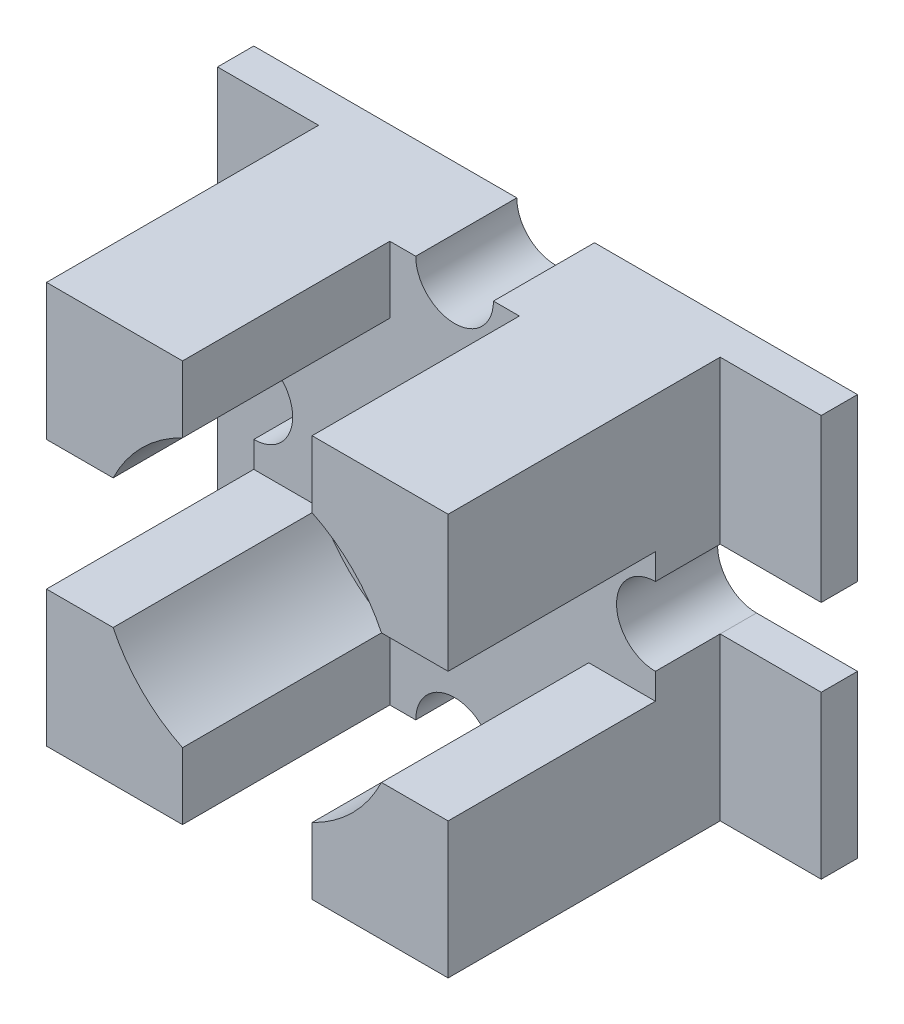
ISO-10303-21;
HEADER;
FILE_DESCRIPTION(('STEP AP214'),'2;1');
FILE_NAME('part.step','',(''),(''),'','','');
FILE_SCHEMA(('AUTOMOTIVE_DESIGN { 1 0 10303 214 1 1 1 1 }'));
ENDSEC;
DATA;
#1=APPLICATION_CONTEXT('core data for automotive mechanical design processes');
#2=APPLICATION_PROTOCOL_DEFINITION('international standard','automotive_design',2000,#1);
#3=PRODUCT_CONTEXT('',#1,'mechanical');
#4=PRODUCT('Part','Part','',(#3));
#5=PRODUCT_RELATED_PRODUCT_CATEGORY('part','',(#4));
#6=PRODUCT_DEFINITION_FORMATION('','',#4);
#7=PRODUCT_DEFINITION_CONTEXT('part definition',#1,'design');
#8=PRODUCT_DEFINITION('design','',#6,#7);
#9=PRODUCT_DEFINITION_SHAPE('','',#8);
#10=(LENGTH_UNIT() NAMED_UNIT(*) SI_UNIT(.MILLI.,.METRE.));
#11=(NAMED_UNIT(*) PLANE_ANGLE_UNIT() SI_UNIT($,.RADIAN.));
#12=(NAMED_UNIT(*) SI_UNIT($,.STERADIAN.) SOLID_ANGLE_UNIT());
#13=UNCERTAINTY_MEASURE_WITH_UNIT(LENGTH_MEASURE(1.E-05),#10,'distance_accuracy_value','');
#14=(GEOMETRIC_REPRESENTATION_CONTEXT(3) GLOBAL_UNCERTAINTY_ASSIGNED_CONTEXT((#13)) GLOBAL_UNIT_ASSIGNED_CONTEXT((#10,
#11,#12)) REPRESENTATION_CONTEXT('',''));
#15=CARTESIAN_POINT('',(0.,0.,0.));
#16=DIRECTION('',(0.,0.,1.));
#17=DIRECTION('',(1.,0.,0.));
#18=AXIS2_PLACEMENT_3D('',#15,#16,#17);
#19=CARTESIAN_POINT('',(-11.65,7.75,3.));
#20=DIRECTION('',(1.,0.,0.));
#21=DIRECTION('',(0.,1.,0.));
#22=AXIS2_PLACEMENT_3D('',#19,#20,#21);
#23=PLANE('',#22);
#24=DIRECTION('',(0.,1.,0.));
#25=VECTOR('',#24,1.);
#26=CARTESIAN_POINT('',(-11.65,7.75,1.6));
#27=LINE('',#26,#25);
#28=CARTESIAN_POINT('',(-11.65,1.5,1.6));
#29=VERTEX_POINT('',#28);
#30=CARTESIAN_POINT('',(-11.65,7.75,1.6));
#31=VERTEX_POINT('',#30);
#32=EDGE_CURVE('E745',#29,#31,#27,.T.);
#33=ORIENTED_EDGE('',*,*,#32,.F.);
#34=DIRECTION('',(0.,0.,-1.));
#35=VECTOR('',#34,1.);
#36=CARTESIAN_POINT('',(-11.65,1.5,13.));
#37=LINE('',#36,#35);
#38=CARTESIAN_POINT('',(-11.65,1.5,3.));
#39=VERTEX_POINT('',#38);
#40=EDGE_CURVE('E719',#39,#29,#37,.T.);
#41=ORIENTED_EDGE('',*,*,#40,.F.);
#42=DIRECTION('',(0.,-1.,0.));
#43=VECTOR('',#42,1.);
#44=CARTESIAN_POINT('',(-11.65,7.75,3.));
#45=LINE('',#44,#43);
#46=CARTESIAN_POINT('',(-11.65,7.75,3.));
#47=VERTEX_POINT('',#46);
#48=EDGE_CURVE('E539',#47,#39,#45,.T.);
#49=ORIENTED_EDGE('',*,*,#48,.F.);
#50=DIRECTION('',(0.,0.,-1.));
#51=VECTOR('',#50,1.);
#52=CARTESIAN_POINT('',(-11.65,7.75,3.));
#53=LINE('',#52,#51);
#54=EDGE_CURVE('E554',#47,#31,#53,.T.);
#55=ORIENTED_EDGE('',*,*,#54,.T.);
#56=EDGE_LOOP('',(#33,#41,#49,#55));
#57=FACE_BOUND('',#56,.T.);
#58=ADVANCED_FACE('F116',(#57),#23,.F.);
#59=CARTESIAN_POINT('',(11.65,-7.75,3.));
#60=DIRECTION('',(0.,1.,0.));
#61=DIRECTION('',(-1.,0.,0.));
#62=AXIS2_PLACEMENT_3D('',#59,#60,#61);
#63=PLANE('',#62);
#64=DIRECTION('',(-1.,0.,0.));
#65=VECTOR('',#64,1.);
#66=CARTESIAN_POINT('',(11.65,-7.75,1.6));
#67=LINE('',#66,#65);
#68=CARTESIAN_POINT('',(11.65,-7.75,1.6));
#69=VERTEX_POINT('',#68);
#70=CARTESIAN_POINT('',(1.5,-7.75,1.6));
#71=VERTEX_POINT('',#70);
#72=EDGE_CURVE('E734',#69,#71,#67,.T.);
#73=ORIENTED_EDGE('',*,*,#72,.F.);
#74=DIRECTION('',(0.,0.,-1.));
#75=VECTOR('',#74,1.);
#76=CARTESIAN_POINT('',(11.65,-7.75,3.));
#77=LINE('',#76,#75);
#78=CARTESIAN_POINT('',(11.65,-7.75,3.));
#79=VERTEX_POINT('',#78);
#80=EDGE_CURVE('E558',#79,#69,#77,.T.);
#81=ORIENTED_EDGE('',*,*,#80,.F.);
#82=DIRECTION('',(1.,0.,0.));
#83=VECTOR('',#82,1.);
#84=CARTESIAN_POINT('',(11.65,-7.75,3.));
#85=LINE('',#84,#83);
#86=CARTESIAN_POINT('',(7.75,-7.75,3.));
#87=VERTEX_POINT('',#86);
#88=EDGE_CURVE('E542',#87,#79,#85,.T.);
#89=ORIENTED_EDGE('',*,*,#88,.F.);
#90=DIRECTION('',(0.,0.,-1.));
#91=VECTOR('',#90,1.);
#92=CARTESIAN_POINT('',(7.75,-7.75,13.5));
#93=LINE('',#92,#91);
#94=CARTESIAN_POINT('',(7.75,-7.75,13.5));
#95=VERTEX_POINT('',#94);
#96=EDGE_CURVE('E532',#95,#87,#93,.T.);
#97=ORIENTED_EDGE('',*,*,#96,.F.);
#98=DIRECTION('',(1.,0.,0.));
#99=VECTOR('',#98,1.);
#100=CARTESIAN_POINT('',(7.75,-7.75,13.5));
#101=LINE('',#100,#99);
#102=CARTESIAN_POINT('',(2.5,-7.75,13.5));
#103=VERTEX_POINT('',#102);
#104=EDGE_CURVE('E506',#103,#95,#101,.T.);
#105=ORIENTED_EDGE('',*,*,#104,.F.);
#106=DIRECTION('',(0.,0.,1.));
#107=VECTOR('',#106,1.);
#108=CARTESIAN_POINT('',(2.5,-7.75,5.5));
#109=LINE('',#108,#107);
#110=CARTESIAN_POINT('',(2.5,-7.75,5.5));
#111=VERTEX_POINT('',#110);
#112=EDGE_CURVE('E478',#111,#103,#109,.T.);
#113=ORIENTED_EDGE('',*,*,#112,.F.);
#114=DIRECTION('',(1.,0.,0.));
#115=VECTOR('',#114,1.);
#116=CARTESIAN_POINT('',(0.,-7.75,5.5));
#117=LINE('',#116,#115);
#118=CARTESIAN_POINT('',(1.5,-7.75,5.5));
#119=VERTEX_POINT('',#118);
#120=EDGE_CURVE('E422',#119,#111,#117,.T.);
#121=ORIENTED_EDGE('',*,*,#120,.F.);
#122=DIRECTION('',(0.,0.,-1.));
#123=VECTOR('',#122,1.);
#124=CARTESIAN_POINT('',(1.5,-7.75,13.));
#125=LINE('',#124,#123);
#126=EDGE_CURVE('E378',#71,#119,#125,.F.);
#127=ORIENTED_EDGE('',*,*,#126,.F.);
#128=EDGE_LOOP('',(#73,#81,#89,#97,#105,#113,#121,#127));
#129=FACE_BOUND('',#128,.T.);
#130=ADVANCED_FACE('F674',(#129),#63,.F.);
#131=DIRECTION('',(-1.,0.,0.));
#132=VECTOR('',#131,1.);
#133=CARTESIAN_POINT('',(11.65,-7.75,1.6));
#134=LINE('',#133,#132);
#135=CARTESIAN_POINT('',(-1.5,-7.75,1.6));
#136=VERTEX_POINT('',#135);
#137=CARTESIAN_POINT('',(-11.65,-7.75,1.6));
#138=VERTEX_POINT('',#137);
#139=EDGE_CURVE('E702',#136,#138,#134,.T.);
#140=ORIENTED_EDGE('',*,*,#139,.F.);
#141=DIRECTION('',(0.,0.,-1.));
#142=VECTOR('',#141,1.);
#143=CARTESIAN_POINT('',(-1.5,-7.75,13.));
#144=LINE('',#143,#142);
#145=CARTESIAN_POINT('',(-1.5,-7.75,5.5));
#146=VERTEX_POINT('',#145);
#147=EDGE_CURVE('E382',#146,#136,#144,.T.);
#148=ORIENTED_EDGE('',*,*,#147,.F.);
#149=CARTESIAN_POINT('',(-2.5,-7.75,5.5));
#150=VERTEX_POINT('',#149);
#151=EDGE_CURVE('E423',#150,#146,#117,.T.);
#152=ORIENTED_EDGE('',*,*,#151,.F.);
#153=DIRECTION('',(0.,0.,1.));
#154=VECTOR('',#153,1.);
#155=CARTESIAN_POINT('',(-2.5,-7.75,5.5));
#156=LINE('',#155,#154);
#157=CARTESIAN_POINT('',(-2.5,-7.75,13.5));
#158=VERTEX_POINT('',#157);
#159=EDGE_CURVE('E480',#150,#158,#156,.T.);
#160=ORIENTED_EDGE('',*,*,#159,.T.);
#161=CARTESIAN_POINT('',(-7.75,-7.75,13.5));
#162=VERTEX_POINT('',#161);
#163=EDGE_CURVE('E508',#162,#158,#101,.T.);
#164=ORIENTED_EDGE('',*,*,#163,.F.);
#165=DIRECTION('',(0.,0.,-1.));
#166=VECTOR('',#165,1.);
#167=CARTESIAN_POINT('',(-7.75,-7.75,13.5));
#168=LINE('',#167,#166);
#169=CARTESIAN_POINT('',(-7.75,-7.75,3.));
#170=VERTEX_POINT('',#169);
#171=EDGE_CURVE('E535',#162,#170,#168,.T.);
#172=ORIENTED_EDGE('',*,*,#171,.T.);
#173=CARTESIAN_POINT('',(-11.65,-7.75,3.));
#174=VERTEX_POINT('',#173);
#175=EDGE_CURVE('E543',#174,#170,#85,.T.);
#176=ORIENTED_EDGE('',*,*,#175,.F.);
#177=DIRECTION('',(0.,0.,-1.));
#178=VECTOR('',#177,1.);
#179=CARTESIAN_POINT('',(-11.65,-7.75,3.));
#180=LINE('',#179,#178);
#181=EDGE_CURVE('E561',#174,#138,#180,.T.);
#182=ORIENTED_EDGE('',*,*,#181,.T.);
#183=EDGE_LOOP('',(#140,#148,#152,#160,#164,#172,#176,#182));
#184=FACE_BOUND('',#183,.T.);
#185=ADVANCED_FACE('F654',(#184),#63,.F.);
#186=CARTESIAN_POINT('',(11.65,7.75,3.));
#187=DIRECTION('',(-1.,0.,0.));
#188=DIRECTION('',(0.,0.,1.));
#189=AXIS2_PLACEMENT_3D('',#186,#187,#188);
#190=PLANE('',#189);
#191=DIRECTION('',(0.,-1.,0.));
#192=VECTOR('',#191,1.);
#193=CARTESIAN_POINT('',(11.65,7.75,1.6));
#194=LINE('',#193,#192);
#195=CARTESIAN_POINT('',(11.65,-1.5,1.6));
#196=VERTEX_POINT('',#195);
#197=EDGE_CURVE('E766',#196,#69,#194,.T.);
#198=ORIENTED_EDGE('',*,*,#197,.F.);
#199=DIRECTION('',(0.,0.,-1.));
#200=VECTOR('',#199,1.);
#201=CARTESIAN_POINT('',(11.65,-1.5,13.));
#202=LINE('',#201,#200);
#203=CARTESIAN_POINT('',(11.65,-1.5,3.));
#204=VERTEX_POINT('',#203);
#205=EDGE_CURVE('E770',#204,#196,#202,.T.);
#206=ORIENTED_EDGE('',*,*,#205,.F.);
#207=DIRECTION('',(0.,1.,0.));
#208=VECTOR('',#207,1.);
#209=CARTESIAN_POINT('',(11.65,7.75,3.));
#210=LINE('',#209,#208);
#211=EDGE_CURVE('E547',#79,#204,#210,.T.);
#212=ORIENTED_EDGE('',*,*,#211,.F.);
#213=ORIENTED_EDGE('',*,*,#80,.T.);
#214=EDGE_LOOP('',(#198,#206,#212,#213));
#215=FACE_BOUND('',#214,.T.);
#216=ADVANCED_FACE('F693',(#215),#190,.F.);
#217=CARTESIAN_POINT('',(11.65,7.75,3.));
#218=DIRECTION('',(0.,-1.,0.));
#219=DIRECTION('',(1.,0.,0.));
#220=AXIS2_PLACEMENT_3D('',#217,#218,#219);
#221=PLANE('',#220);
#222=DIRECTION('',(1.,0.,0.));
#223=VECTOR('',#222,1.);
#224=CARTESIAN_POINT('',(11.65,7.75,1.6));
#225=LINE('',#224,#223);
#226=CARTESIAN_POINT('',(-1.5,7.75,1.6));
#227=VERTEX_POINT('',#226);
#228=EDGE_CURVE('E130',#31,#227,#225,.T.);
#229=ORIENTED_EDGE('',*,*,#228,.F.);
#230=ORIENTED_EDGE('',*,*,#54,.F.);
#231=DIRECTION('',(-1.,0.,0.));
#232=VECTOR('',#231,1.);
#233=CARTESIAN_POINT('',(11.65,7.75,3.));
#234=LINE('',#233,#232);
#235=CARTESIAN_POINT('',(-7.75,7.75,3.));
#236=VERTEX_POINT('',#235);
#237=EDGE_CURVE('E550',#236,#47,#234,.T.);
#238=ORIENTED_EDGE('',*,*,#237,.F.);
#239=DIRECTION('',(0.,0.,-1.));
#240=VECTOR('',#239,1.);
#241=CARTESIAN_POINT('',(-7.75,7.75,13.5));
#242=LINE('',#241,#240);
#243=CARTESIAN_POINT('',(-7.75,7.75,13.5));
#244=VERTEX_POINT('',#243);
#245=EDGE_CURVE('E519',#244,#236,#242,.T.);
#246=ORIENTED_EDGE('',*,*,#245,.F.);
#247=DIRECTION('',(-1.,0.,0.));
#248=VECTOR('',#247,1.);
#249=CARTESIAN_POINT('',(7.75,7.75,13.5));
#250=LINE('',#249,#248);
#251=CARTESIAN_POINT('',(-2.5,7.75,13.5));
#252=VERTEX_POINT('',#251);
#253=EDGE_CURVE('E515',#252,#244,#250,.T.);
#254=ORIENTED_EDGE('',*,*,#253,.F.);
#255=DIRECTION('',(0.,0.,1.));
#256=VECTOR('',#255,1.);
#257=CARTESIAN_POINT('',(-2.5,7.75,5.5));
#258=LINE('',#257,#256);
#259=CARTESIAN_POINT('',(-2.5,7.75,5.5));
#260=VERTEX_POINT('',#259);
#261=EDGE_CURVE('E496',#260,#252,#258,.T.);
#262=ORIENTED_EDGE('',*,*,#261,.F.);
#263=DIRECTION('',(-1.,0.,0.));
#264=VECTOR('',#263,1.);
#265=CARTESIAN_POINT('',(0.,7.75,5.5));
#266=LINE('',#265,#264);
#267=CARTESIAN_POINT('',(-1.5,7.75,5.5));
#268=VERTEX_POINT('',#267);
#269=EDGE_CURVE('E404',#268,#260,#266,.T.);
#270=ORIENTED_EDGE('',*,*,#269,.F.);
#271=DIRECTION('',(0.,0.,-1.));
#272=VECTOR('',#271,1.);
#273=CARTESIAN_POINT('',(-1.5,7.75,13.));
#274=LINE('',#273,#272);
#275=EDGE_CURVE('E377',#227,#268,#274,.F.);
#276=ORIENTED_EDGE('',*,*,#275,.F.);
#277=EDGE_LOOP('',(#229,#230,#238,#246,#254,#262,#270,#276));
#278=FACE_BOUND('',#277,.T.);
#279=ADVANCED_FACE('F577',(#278),#221,.F.);
#280=DIRECTION('',(1.,0.,0.));
#281=VECTOR('',#280,1.);
#282=CARTESIAN_POINT('',(11.65,7.75,1.6));
#283=LINE('',#282,#281);
#284=CARTESIAN_POINT('',(1.5,7.75,1.6));
#285=VERTEX_POINT('',#284);
#286=CARTESIAN_POINT('',(11.65,7.75,1.6));
#287=VERTEX_POINT('',#286);
#288=EDGE_CURVE('E359',#285,#287,#283,.T.);
#289=ORIENTED_EDGE('',*,*,#288,.F.);
#290=DIRECTION('',(0.,0.,-1.));
#291=VECTOR('',#290,1.);
#292=CARTESIAN_POINT('',(1.5,7.75,13.));
#293=LINE('',#292,#291);
#294=CARTESIAN_POINT('',(1.5,7.75,5.5));
#295=VERTEX_POINT('',#294);
#296=EDGE_CURVE('E369',#295,#285,#293,.T.);
#297=ORIENTED_EDGE('',*,*,#296,.F.);
#298=CARTESIAN_POINT('',(2.5,7.75,5.5));
#299=VERTEX_POINT('',#298);
#300=EDGE_CURVE('E405',#299,#295,#266,.T.);
#301=ORIENTED_EDGE('',*,*,#300,.F.);
#302=DIRECTION('',(0.,0.,1.));
#303=VECTOR('',#302,1.);
#304=CARTESIAN_POINT('',(2.5,7.75,5.5));
#305=LINE('',#304,#303);
#306=CARTESIAN_POINT('',(2.5,7.75,13.5));
#307=VERTEX_POINT('',#306);
#308=EDGE_CURVE('E498',#299,#307,#305,.T.);
#309=ORIENTED_EDGE('',*,*,#308,.T.);
#310=CARTESIAN_POINT('',(7.75,7.75,13.5));
#311=VERTEX_POINT('',#310);
#312=EDGE_CURVE('E516',#311,#307,#250,.T.);
#313=ORIENTED_EDGE('',*,*,#312,.F.);
#314=DIRECTION('',(0.,0.,-1.));
#315=VECTOR('',#314,1.);
#316=CARTESIAN_POINT('',(7.75,7.75,13.5));
#317=LINE('',#316,#315);
#318=CARTESIAN_POINT('',(7.75,7.75,3.));
#319=VERTEX_POINT('',#318);
#320=EDGE_CURVE('E529',#311,#319,#317,.T.);
#321=ORIENTED_EDGE('',*,*,#320,.T.);
#322=CARTESIAN_POINT('',(11.65,7.75,3.));
#323=VERTEX_POINT('',#322);
#324=EDGE_CURVE('E551',#323,#319,#234,.T.);
#325=ORIENTED_EDGE('',*,*,#324,.F.);
#326=DIRECTION('',(0.,0.,-1.));
#327=VECTOR('',#326,1.);
#328=CARTESIAN_POINT('',(11.65,7.75,3.));
#329=LINE('',#328,#327);
#330=EDGE_CURVE('E373',#323,#287,#329,.T.);
#331=ORIENTED_EDGE('',*,*,#330,.T.);
#332=EDGE_LOOP('',(#289,#297,#301,#309,#313,#321,#325,#331));
#333=FACE_BOUND('',#332,.T.);
#334=ADVANCED_FACE('F367',(#333),#221,.F.);
#335=DIRECTION('',(0.,1.,0.));
#336=VECTOR('',#335,1.);
#337=CARTESIAN_POINT('',(-11.65,7.75,1.6));
#338=LINE('',#337,#336);
#339=CARTESIAN_POINT('',(-11.65,-1.5,1.6));
#340=VERTEX_POINT('',#339);
#341=EDGE_CURVE('E698',#138,#340,#338,.T.);
#342=ORIENTED_EDGE('',*,*,#341,.F.);
#343=ORIENTED_EDGE('',*,*,#181,.F.);
#344=CARTESIAN_POINT('',(-11.65,-1.5,3.));
#345=VERTEX_POINT('',#344);
#346=EDGE_CURVE('E538',#345,#174,#45,.T.);
#347=ORIENTED_EDGE('',*,*,#346,.F.);
#348=DIRECTION('',(0.,0.,-1.));
#349=VECTOR('',#348,1.);
#350=CARTESIAN_POINT('',(-11.65,-1.5,13.));
#351=LINE('',#350,#349);
#352=EDGE_CURVE('E700',#345,#340,#351,.T.);
#353=ORIENTED_EDGE('',*,*,#352,.T.);
#354=EDGE_LOOP('',(#342,#343,#347,#353));
#355=FACE_BOUND('',#354,.T.);
#356=ADVANCED_FACE('F676',(#355),#23,.F.);
#357=DIRECTION('',(0.,-1.,0.));
#358=VECTOR('',#357,1.);
#359=CARTESIAN_POINT('',(11.65,7.75,1.6));
#360=LINE('',#359,#358);
#361=CARTESIAN_POINT('',(11.65,1.5,1.6));
#362=VERTEX_POINT('',#361);
#363=EDGE_CURVE('E748',#287,#362,#360,.T.);
#364=ORIENTED_EDGE('',*,*,#363,.F.);
#365=ORIENTED_EDGE('',*,*,#330,.F.);
#366=CARTESIAN_POINT('',(11.65,1.5,3.));
#367=VERTEX_POINT('',#366);
#368=EDGE_CURVE('E546',#367,#323,#210,.T.);
#369=ORIENTED_EDGE('',*,*,#368,.F.);
#370=DIRECTION('',(0.,0.,-1.));
#371=VECTOR('',#370,1.);
#372=CARTESIAN_POINT('',(11.65,1.5,13.));
#373=LINE('',#372,#371);
#374=EDGE_CURVE('E729',#367,#362,#373,.T.);
#375=ORIENTED_EDGE('',*,*,#374,.T.);
#376=EDGE_LOOP('',(#364,#365,#369,#375));
#377=FACE_BOUND('',#376,.T.);
#378=ADVANCED_FACE('F684',(#377),#190,.F.);
#379=CARTESIAN_POINT('',(0.,-7.75,13.));
#380=DIRECTION('',(0.,0.,-1.));
#381=DIRECTION('',(-1.,0.,0.));
#382=AXIS2_PLACEMENT_3D('',#379,#380,#381);
#383=CYLINDRICAL_SURFACE('',#382,1.5);
#384=ORIENTED_EDGE('',*,*,#147,.T.);
#385=CARTESIAN_POINT('',(0.,-7.75,1.6));
#386=DIRECTION('',(0.,0.,-1.));
#387=DIRECTION('',(-1.,0.,0.));
#388=AXIS2_PLACEMENT_3D('',#385,#386,#387);
#389=CIRCLE('',#388,1.5);
#390=EDGE_CURVE('E764',#136,#71,#389,.T.);
#391=ORIENTED_EDGE('',*,*,#390,.T.);
#392=ORIENTED_EDGE('',*,*,#126,.T.);
#393=CARTESIAN_POINT('',(0.,-7.75,5.5));
#394=DIRECTION('',(0.,0.,1.));
#395=DIRECTION('',(1.,0.,0.));
#396=AXIS2_PLACEMENT_3D('',#393,#394,#395);
#397=CIRCLE('',#396,1.5);
#398=EDGE_CURVE('E564',#146,#119,#397,.F.);
#399=ORIENTED_EDGE('',*,*,#398,.F.);
#400=EDGE_LOOP('',(#384,#391,#392,#399));
#401=FACE_BOUND('',#400,.T.);
#402=ADVANCED_FACE('F690',(#401),#383,.F.);
#403=CARTESIAN_POINT('',(0.,1.5,13.));
#404=DIRECTION('',(0.,-1.,0.));
#405=DIRECTION('',(0.,0.,-1.));
#406=AXIS2_PLACEMENT_3D('',#403,#404,#405);
#407=PLANE('',#406);
#408=ORIENTED_EDGE('',*,*,#40,.T.);
#409=DIRECTION('',(1.,0.,0.));
#410=VECTOR('',#409,1.);
#411=CARTESIAN_POINT('',(0.,1.5,1.6));
#412=LINE('',#411,#410);
#413=CARTESIAN_POINT('',(-7.75,1.5,1.6));
#414=VERTEX_POINT('',#413);
#415=EDGE_CURVE('E746',#29,#414,#412,.T.);
#416=ORIENTED_EDGE('',*,*,#415,.T.);
#417=DIRECTION('',(0.,0.,-1.));
#418=VECTOR('',#417,1.);
#419=CARTESIAN_POINT('',(-7.75,1.5,13.));
#420=LINE('',#419,#418);
#421=CARTESIAN_POINT('',(-7.75,1.5,3.));
#422=VERTEX_POINT('',#421);
#423=EDGE_CURVE('E733',#422,#414,#420,.T.);
#424=ORIENTED_EDGE('',*,*,#423,.F.);
#425=DIRECTION('',(-1.,0.,0.));
#426=VECTOR('',#425,1.);
#427=CARTESIAN_POINT('',(0.,1.5,3.));
#428=LINE('',#427,#426);
#429=EDGE_CURVE('E393',#422,#39,#428,.T.);
#430=ORIENTED_EDGE('',*,*,#429,.T.);
#431=EDGE_LOOP('',(#408,#416,#424,#430));
#432=FACE_BOUND('',#431,.T.);
#433=ADVANCED_FACE('F803',(#432),#407,.T.);
#434=CARTESIAN_POINT('',(0.,-1.5,13.));
#435=DIRECTION('',(0.,-1.,0.));
#436=DIRECTION('',(1.,0.,0.));
#437=AXIS2_PLACEMENT_3D('',#434,#435,#436);
#438=PLANE('',#437);
#439=DIRECTION('',(1.,0.,0.));
#440=VECTOR('',#439,1.);
#441=CARTESIAN_POINT('',(0.,-1.5,1.6));
#442=LINE('',#441,#440);
#443=CARTESIAN_POINT('',(-7.75,-1.5,1.6));
#444=VERTEX_POINT('',#443);
#445=EDGE_CURVE('E703',#340,#444,#442,.T.);
#446=ORIENTED_EDGE('',*,*,#445,.F.);
#447=ORIENTED_EDGE('',*,*,#352,.F.);
#448=DIRECTION('',(-1.,0.,0.));
#449=VECTOR('',#448,1.);
#450=CARTESIAN_POINT('',(0.,-1.5,3.));
#451=LINE('',#450,#449);
#452=CARTESIAN_POINT('',(-7.75,-1.5,3.));
#453=VERTEX_POINT('',#452);
#454=EDGE_CURVE('E390',#453,#345,#451,.T.);
#455=ORIENTED_EDGE('',*,*,#454,.F.);
#456=DIRECTION('',(0.,0.,-1.));
#457=VECTOR('',#456,1.);
#458=CARTESIAN_POINT('',(-7.75,-1.5,13.));
#459=LINE('',#458,#457);
#460=EDGE_CURVE('E712',#453,#444,#459,.T.);
#461=ORIENTED_EDGE('',*,*,#460,.T.);
#462=EDGE_LOOP('',(#446,#447,#455,#461));
#463=FACE_BOUND('',#462,.T.);
#464=ADVANCED_FACE('F711',(#463),#438,.F.);
#465=CARTESIAN_POINT('',(-7.75,0.,0.));
#466=DIRECTION('',(0.,0.,1.));
#467=DIRECTION('',(1.,0.,0.));
#468=AXIS2_PLACEMENT_3D('',#465,#466,#467);
#469=CYLINDRICAL_SURFACE('',#468,1.5);
#470=CARTESIAN_POINT('',(-7.75,0.,1.6));
#471=DIRECTION('',(0.,0.,-1.));
#472=DIRECTION('',(-1.,0.,0.));
#473=AXIS2_PLACEMENT_3D('',#470,#471,#472);
#474=CIRCLE('',#473,1.5);
#475=EDGE_CURVE('E716',#444,#414,#474,.F.);
#476=ORIENTED_EDGE('',*,*,#475,.F.);
#477=ORIENTED_EDGE('',*,*,#460,.F.);
#478=CARTESIAN_POINT('',(-7.75,-1.5,5.5));
#479=VERTEX_POINT('',#478);
#480=EDGE_CURVE('E639',#479,#453,#459,.T.);
#481=ORIENTED_EDGE('',*,*,#480,.F.);
#482=CARTESIAN_POINT('',(-7.75,0.,5.5));
#483=DIRECTION('',(0.,0.,1.));
#484=DIRECTION('',(1.,0.,0.));
#485=AXIS2_PLACEMENT_3D('',#482,#483,#484);
#486=CIRCLE('',#485,1.5);
#487=CARTESIAN_POINT('',(-7.75,1.5,5.5));
#488=VERTEX_POINT('',#487);
#489=EDGE_CURVE('E567',#479,#488,#486,.T.);
#490=ORIENTED_EDGE('',*,*,#489,.T.);
#491=EDGE_CURVE('E630',#488,#422,#420,.T.);
#492=ORIENTED_EDGE('',*,*,#491,.T.);
#493=ORIENTED_EDGE('',*,*,#423,.T.);
#494=EDGE_LOOP('',(#476,#477,#481,#490,#492,#493));
#495=FACE_BOUND('',#494,.T.);
#496=ADVANCED_FACE('F714',(#495),#469,.F.);
#497=CARTESIAN_POINT('',(0.,-1.5,13.));
#498=DIRECTION('',(0.,1.,0.));
#499=DIRECTION('',(-1.,0.,0.));
#500=AXIS2_PLACEMENT_3D('',#497,#498,#499);
#501=PLANE('',#500);
#502=ORIENTED_EDGE('',*,*,#205,.T.);
#503=DIRECTION('',(-1.,0.,0.));
#504=VECTOR('',#503,1.);
#505=CARTESIAN_POINT('',(0.,-1.5,1.6));
#506=LINE('',#505,#504);
#507=CARTESIAN_POINT('',(7.75,-1.5,1.6));
#508=VERTEX_POINT('',#507);
#509=EDGE_CURVE('E761',#196,#508,#506,.T.);
#510=ORIENTED_EDGE('',*,*,#509,.T.);
#511=DIRECTION('',(0.,0.,-1.));
#512=VECTOR('',#511,1.);
#513=CARTESIAN_POINT('',(7.75,-1.5,13.));
#514=LINE('',#513,#512);
#515=CARTESIAN_POINT('',(7.75,-1.5,3.));
#516=VERTEX_POINT('',#515);
#517=EDGE_CURVE('E718',#516,#508,#514,.T.);
#518=ORIENTED_EDGE('',*,*,#517,.F.);
#519=DIRECTION('',(1.,0.,0.));
#520=VECTOR('',#519,1.);
#521=CARTESIAN_POINT('',(0.,-1.5,3.));
#522=LINE('',#521,#520);
#523=EDGE_CURVE('E388',#516,#204,#522,.T.);
#524=ORIENTED_EDGE('',*,*,#523,.T.);
#525=EDGE_LOOP('',(#502,#510,#518,#524));
#526=FACE_BOUND('',#525,.T.);
#527=ADVANCED_FACE('F789',(#526),#501,.T.);
#528=CARTESIAN_POINT('',(0.,1.50000000000001,13.));
#529=DIRECTION('',(0.,1.,0.));
#530=DIRECTION('',(-1.,0.,0.));
#531=AXIS2_PLACEMENT_3D('',#528,#529,#530);
#532=PLANE('',#531);
#533=DIRECTION('',(-1.,0.,0.));
#534=VECTOR('',#533,1.);
#535=CARTESIAN_POINT('',(0.,1.50000000000001,1.6));
#536=LINE('',#535,#534);
#537=CARTESIAN_POINT('',(7.75,1.5,1.6));
#538=VERTEX_POINT('',#537);
#539=EDGE_CURVE('E753',#362,#538,#536,.T.);
#540=ORIENTED_EDGE('',*,*,#539,.F.);
#541=ORIENTED_EDGE('',*,*,#374,.F.);
#542=DIRECTION('',(1.,0.,0.));
#543=VECTOR('',#542,1.);
#544=CARTESIAN_POINT('',(0.,1.50000000000001,3.));
#545=LINE('',#544,#543);
#546=CARTESIAN_POINT('',(7.75,1.5,3.));
#547=VERTEX_POINT('',#546);
#548=EDGE_CURVE('E380',#547,#367,#545,.T.);
#549=ORIENTED_EDGE('',*,*,#548,.F.);
#550=DIRECTION('',(0.,0.,-1.));
#551=VECTOR('',#550,1.);
#552=CARTESIAN_POINT('',(7.75,1.5,13.));
#553=LINE('',#552,#551);
#554=EDGE_CURVE('E724',#547,#538,#553,.T.);
#555=ORIENTED_EDGE('',*,*,#554,.T.);
#556=EDGE_LOOP('',(#540,#541,#549,#555));
#557=FACE_BOUND('',#556,.T.);
#558=ADVANCED_FACE('F791',(#557),#532,.F.);
#559=CARTESIAN_POINT('',(7.75,0.,13.));
#560=DIRECTION('',(0.,0.,-1.));
#561=DIRECTION('',(-1.,0.,0.));
#562=AXIS2_PLACEMENT_3D('',#559,#560,#561);
#563=CYLINDRICAL_SURFACE('',#562,1.5);
#564=ORIENTED_EDGE('',*,*,#517,.T.);
#565=CARTESIAN_POINT('',(7.75,0.,1.6));
#566=DIRECTION('',(0.,0.,-1.));
#567=DIRECTION('',(-1.,0.,0.));
#568=AXIS2_PLACEMENT_3D('',#565,#566,#567);
#569=CIRCLE('',#568,1.5);
#570=EDGE_CURVE('E758',#508,#538,#569,.T.);
#571=ORIENTED_EDGE('',*,*,#570,.T.);
#572=ORIENTED_EDGE('',*,*,#554,.F.);
#573=CARTESIAN_POINT('',(7.75,1.5,5.5));
#574=VERTEX_POINT('',#573);
#575=EDGE_CURVE('E137',#574,#547,#553,.T.);
#576=ORIENTED_EDGE('',*,*,#575,.F.);
#577=CARTESIAN_POINT('',(7.75,0.,5.5));
#578=DIRECTION('',(0.,0.,1.));
#579=DIRECTION('',(1.,0.,0.));
#580=AXIS2_PLACEMENT_3D('',#577,#578,#579);
#581=CIRCLE('',#580,1.5);
#582=CARTESIAN_POINT('',(7.75,-1.5,5.5));
#583=VERTEX_POINT('',#582);
#584=EDGE_CURVE('E569',#583,#574,#581,.F.);
#585=ORIENTED_EDGE('',*,*,#584,.F.);
#586=EDGE_CURVE('E612',#583,#516,#514,.T.);
#587=ORIENTED_EDGE('',*,*,#586,.T.);
#588=EDGE_LOOP('',(#564,#571,#572,#576,#585,#587));
#589=FACE_BOUND('',#588,.T.);
#590=ADVANCED_FACE('F776',(#589),#563,.F.);
#591=CARTESIAN_POINT('',(0.,7.75,13.));
#592=DIRECTION('',(0.,0.,-1.));
#593=DIRECTION('',(-1.,0.,0.));
#594=AXIS2_PLACEMENT_3D('',#591,#592,#593);
#595=CYLINDRICAL_SURFACE('',#594,1.5);
#596=ORIENTED_EDGE('',*,*,#296,.T.);
#597=CARTESIAN_POINT('',(0.,7.75,1.6));
#598=DIRECTION('',(0.,0.,-1.));
#599=DIRECTION('',(-1.,0.,0.));
#600=AXIS2_PLACEMENT_3D('',#597,#598,#599);
#601=CIRCLE('',#600,1.5);
#602=EDGE_CURVE('E12',#285,#227,#601,.T.);
#603=ORIENTED_EDGE('',*,*,#602,.T.);
#604=ORIENTED_EDGE('',*,*,#275,.T.);
#605=CARTESIAN_POINT('',(0.,7.75,5.5));
#606=DIRECTION('',(0.,0.,1.));
#607=DIRECTION('',(1.,0.,0.));
#608=AXIS2_PLACEMENT_3D('',#605,#606,#607);
#609=CIRCLE('',#608,1.5);
#610=EDGE_CURVE('E123',#295,#268,#609,.F.);
#611=ORIENTED_EDGE('',*,*,#610,.F.);
#612=EDGE_LOOP('',(#596,#603,#604,#611));
#613=FACE_BOUND('',#612,.T.);
#614=ADVANCED_FACE('F375',(#613),#595,.F.);
#615=CARTESIAN_POINT('',(0.,0.,3.));
#616=DIRECTION('',(0.,0.,-1.));
#617=DIRECTION('',(-1.,0.,0.));
#618=AXIS2_PLACEMENT_3D('',#615,#616,#617);
#619=PLANE('',#618);
#620=ORIENTED_EDGE('',*,*,#429,.F.);
#621=DIRECTION('',(0.,-1.,0.));
#622=VECTOR('',#621,1.);
#623=CARTESIAN_POINT('',(-7.75,7.75,3.));
#624=LINE('',#623,#622);
#625=EDGE_CURVE('E520',#236,#422,#624,.T.);
#626=ORIENTED_EDGE('',*,*,#625,.F.);
#627=ORIENTED_EDGE('',*,*,#237,.T.);
#628=ORIENTED_EDGE('',*,*,#48,.T.);
#629=EDGE_LOOP('',(#620,#626,#627,#628));
#630=FACE_BOUND('',#629,.T.);
#631=ADVANCED_FACE('F741',(#630),#619,.F.);
#632=ORIENTED_EDGE('',*,*,#523,.F.);
#633=DIRECTION('',(0.,1.,0.));
#634=VECTOR('',#633,1.);
#635=CARTESIAN_POINT('',(7.75,7.75,3.));
#636=LINE('',#635,#634);
#637=EDGE_CURVE('E524',#87,#516,#636,.T.);
#638=ORIENTED_EDGE('',*,*,#637,.F.);
#639=ORIENTED_EDGE('',*,*,#88,.T.);
#640=ORIENTED_EDGE('',*,*,#211,.T.);
#641=EDGE_LOOP('',(#632,#638,#639,#640));
#642=FACE_BOUND('',#641,.T.);
#643=ADVANCED_FACE('F778',(#642),#619,.F.);
#644=CARTESIAN_POINT('',(-7.75,7.75,13.5));
#645=DIRECTION('',(1.,0.,0.));
#646=DIRECTION('',(0.,1.,0.));
#647=AXIS2_PLACEMENT_3D('',#644,#645,#646);
#648=PLANE('',#647);
#649=ORIENTED_EDGE('',*,*,#625,.T.);
#650=ORIENTED_EDGE('',*,*,#491,.F.);
#651=DIRECTION('',(0.,-1.,0.));
#652=VECTOR('',#651,1.);
#653=CARTESIAN_POINT('',(-7.75,0.,5.5));
#654=LINE('',#653,#652);
#655=CARTESIAN_POINT('',(-7.75,2.5,5.5));
#656=VERTEX_POINT('',#655);
#657=EDGE_CURVE('E413',#656,#488,#654,.T.);
#658=ORIENTED_EDGE('',*,*,#657,.F.);
#659=DIRECTION('',(0.,0.,1.));
#660=VECTOR('',#659,1.);
#661=CARTESIAN_POINT('',(-7.75,2.5,5.5));
#662=LINE('',#661,#660);
#663=CARTESIAN_POINT('',(-7.75,2.5,13.5));
#664=VERTEX_POINT('',#663);
#665=EDGE_CURVE('E489',#656,#664,#662,.T.);
#666=ORIENTED_EDGE('',*,*,#665,.T.);
#667=DIRECTION('',(0.,-1.,0.));
#668=VECTOR('',#667,1.);
#669=CARTESIAN_POINT('',(-7.75,7.75,13.5));
#670=LINE('',#669,#668);
#671=EDGE_CURVE('E503',#244,#664,#670,.T.);
#672=ORIENTED_EDGE('',*,*,#671,.F.);
#673=ORIENTED_EDGE('',*,*,#245,.T.);
#674=EDGE_LOOP('',(#649,#650,#658,#666,#672,#673));
#675=FACE_BOUND('',#674,.T.);
#676=ADVANCED_FACE('F627',(#675),#648,.F.);
#677=CARTESIAN_POINT('',(7.75,7.75,13.5));
#678=DIRECTION('',(-1.,0.,0.));
#679=DIRECTION('',(0.,-1.,0.));
#680=AXIS2_PLACEMENT_3D('',#677,#678,#679);
#681=PLANE('',#680);
#682=ORIENTED_EDGE('',*,*,#586,.F.);
#683=DIRECTION('',(0.,1.,0.));
#684=VECTOR('',#683,1.);
#685=CARTESIAN_POINT('',(7.75,0.,5.5));
#686=LINE('',#685,#684);
#687=CARTESIAN_POINT('',(7.75,-2.5,5.5));
#688=VERTEX_POINT('',#687);
#689=EDGE_CURVE('E432',#688,#583,#686,.T.);
#690=ORIENTED_EDGE('',*,*,#689,.F.);
#691=DIRECTION('',(0.,0.,1.));
#692=VECTOR('',#691,1.);
#693=CARTESIAN_POINT('',(7.75,-2.5,5.5));
#694=LINE('',#693,#692);
#695=CARTESIAN_POINT('',(7.75,-2.5,13.5));
#696=VERTEX_POINT('',#695);
#697=EDGE_CURVE('E471',#688,#696,#694,.T.);
#698=ORIENTED_EDGE('',*,*,#697,.T.);
#699=DIRECTION('',(0.,1.,0.));
#700=VECTOR('',#699,1.);
#701=CARTESIAN_POINT('',(7.75,7.75,13.5));
#702=LINE('',#701,#700);
#703=EDGE_CURVE('E512',#95,#696,#702,.T.);
#704=ORIENTED_EDGE('',*,*,#703,.F.);
#705=ORIENTED_EDGE('',*,*,#96,.T.);
#706=ORIENTED_EDGE('',*,*,#637,.T.);
#707=EDGE_LOOP('',(#682,#690,#698,#704,#705,#706));
#708=FACE_BOUND('',#707,.T.);
#709=ADVANCED_FACE('F610',(#708),#681,.F.);
#710=CARTESIAN_POINT('',(0.,0.,5.5));
#711=DIRECTION('',(0.,0.,1.));
#712=DIRECTION('',(1.,0.,0.));
#713=AXIS2_PLACEMENT_3D('',#710,#711,#712);
#714=PLANE('',#713);
#715=ORIENTED_EDGE('',*,*,#300,.T.);
#716=ORIENTED_EDGE('',*,*,#610,.T.);
#717=ORIENTED_EDGE('',*,*,#269,.T.);
#718=DIRECTION('',(0.,-1.,0.));
#719=VECTOR('',#718,1.);
#720=CARTESIAN_POINT('',(-2.5,0.,5.5));
#721=LINE('',#720,#719);
#722=CARTESIAN_POINT('',(-2.5,5.17807879430199,5.5));
#723=VERTEX_POINT('',#722);
#724=EDGE_CURVE('E407',#260,#723,#721,.T.);
#725=ORIENTED_EDGE('',*,*,#724,.T.);
#726=CARTESIAN_POINT('',(0.,0.,5.5));
#727=DIRECTION('',(0.,0.,1.));
#728=DIRECTION('',(1.,0.,0.));
#729=AXIS2_PLACEMENT_3D('',#726,#727,#728);
#730=CIRCLE('',#729,5.75);
#731=CARTESIAN_POINT('',(-5.17807879430199,2.5,5.5));
#732=VERTEX_POINT('',#731);
#733=EDGE_CURVE('E402',#723,#732,#730,.T.);
#734=ORIENTED_EDGE('',*,*,#733,.T.);
#735=DIRECTION('',(1.,0.,0.));
#736=VECTOR('',#735,1.);
#737=CARTESIAN_POINT('',(0.,2.5,5.5));
#738=LINE('',#737,#736);
#739=EDGE_CURVE('E410',#656,#732,#738,.T.);
#740=ORIENTED_EDGE('',*,*,#739,.F.);
#741=ORIENTED_EDGE('',*,*,#657,.T.);
#742=ORIENTED_EDGE('',*,*,#489,.F.);
#743=CARTESIAN_POINT('',(-7.75,-2.5,5.5));
#744=VERTEX_POINT('',#743);
#745=EDGE_CURVE('E412',#479,#744,#654,.T.);
#746=ORIENTED_EDGE('',*,*,#745,.T.);
#747=DIRECTION('',(1.,0.,0.));
#748=VECTOR('',#747,1.);
#749=CARTESIAN_POINT('',(0.,-2.5,5.5));
#750=LINE('',#749,#748);
#751=CARTESIAN_POINT('',(-5.17807879430199,-2.5,5.5));
#752=VERTEX_POINT('',#751);
#753=EDGE_CURVE('E416',#744,#752,#750,.T.);
#754=ORIENTED_EDGE('',*,*,#753,.T.);
#755=CARTESIAN_POINT('',(-2.5,-5.17807879430199,5.5));
#756=VERTEX_POINT('',#755);
#757=EDGE_CURVE('E419',#752,#756,#730,.T.);
#758=ORIENTED_EDGE('',*,*,#757,.T.);
#759=DIRECTION('',(0.,1.,0.));
#760=VECTOR('',#759,1.);
#761=CARTESIAN_POINT('',(-2.5,0.,5.5));
#762=LINE('',#761,#760);
#763=EDGE_CURVE('E420',#150,#756,#762,.T.);
#764=ORIENTED_EDGE('',*,*,#763,.F.);
#765=ORIENTED_EDGE('',*,*,#151,.T.);
#766=ORIENTED_EDGE('',*,*,#398,.T.);
#767=ORIENTED_EDGE('',*,*,#120,.T.);
#768=DIRECTION('',(0.,1.,0.));
#769=VECTOR('',#768,1.);
#770=CARTESIAN_POINT('',(2.5,0.,5.5));
#771=LINE('',#770,#769);
#772=CARTESIAN_POINT('',(2.5,-5.178078794302,5.5));
#773=VERTEX_POINT('',#772);
#774=EDGE_CURVE('E426',#111,#773,#771,.T.);
#775=ORIENTED_EDGE('',*,*,#774,.T.);
#776=CARTESIAN_POINT('',(5.178078794302,-2.5,5.5));
#777=VERTEX_POINT('',#776);
#778=EDGE_CURVE('E401',#773,#777,#730,.T.);
#779=ORIENTED_EDGE('',*,*,#778,.T.);
#780=DIRECTION('',(-1.,0.,0.));
#781=VECTOR('',#780,1.);
#782=CARTESIAN_POINT('',(0.,-2.5,5.5));
#783=LINE('',#782,#781);
#784=EDGE_CURVE('E429',#688,#777,#783,.T.);
#785=ORIENTED_EDGE('',*,*,#784,.F.);
#786=ORIENTED_EDGE('',*,*,#689,.T.);
#787=ORIENTED_EDGE('',*,*,#584,.T.);
#788=CARTESIAN_POINT('',(7.75,2.5,5.5));
#789=VERTEX_POINT('',#788);
#790=EDGE_CURVE('E431',#574,#789,#686,.T.);
#791=ORIENTED_EDGE('',*,*,#790,.T.);
#792=DIRECTION('',(-1.,0.,0.));
#793=VECTOR('',#792,1.);
#794=CARTESIAN_POINT('',(0.,2.5,5.5));
#795=LINE('',#794,#793);
#796=CARTESIAN_POINT('',(5.17807879430199,2.5,5.5));
#797=VERTEX_POINT('',#796);
#798=EDGE_CURVE('E435',#789,#797,#795,.T.);
#799=ORIENTED_EDGE('',*,*,#798,.T.);
#800=CARTESIAN_POINT('',(2.5,5.178078794302,5.5));
#801=VERTEX_POINT('',#800);
#802=EDGE_CURVE('E396',#797,#801,#730,.T.);
#803=ORIENTED_EDGE('',*,*,#802,.T.);
#804=DIRECTION('',(0.,-1.,0.));
#805=VECTOR('',#804,1.);
#806=CARTESIAN_POINT('',(2.5,0.,5.5));
#807=LINE('',#806,#805);
#808=EDGE_CURVE('E399',#299,#801,#807,.T.);
#809=ORIENTED_EDGE('',*,*,#808,.F.);
#810=EDGE_LOOP('',(#715,#716,#717,#725,#734,#740,#741,#742,#746,#754,#758,#764,#765,#766,#767,
#775,#779,#785,#786,#787,#791,#799,#803,#809));
#811=FACE_BOUND('',#810,.T.);
#812=ADVANCED_FACE('F572',(#811),#714,.T.);
#813=CARTESIAN_POINT('',(0.,0.,13.5));
#814=DIRECTION('',(0.,0.,-1.));
#815=DIRECTION('',(-1.,0.,0.));
#816=AXIS2_PLACEMENT_3D('',#813,#814,#815);
#817=PLANE('',#816);
#818=DIRECTION('',(-1.,0.,0.));
#819=VECTOR('',#818,1.);
#820=CARTESIAN_POINT('',(0.,-2.5,13.5));
#821=LINE('',#820,#819);
#822=CARTESIAN_POINT('',(5.178078794302,-2.5,13.5));
#823=VERTEX_POINT('',#822);
#824=EDGE_CURVE('E461',#696,#823,#821,.T.);
#825=ORIENTED_EDGE('',*,*,#824,.T.);
#826=CARTESIAN_POINT('',(0.,0.,13.5));
#827=DIRECTION('',(0.,0.,1.));
#828=DIRECTION('',(1.,0.,0.));
#829=AXIS2_PLACEMENT_3D('',#826,#827,#828);
#830=CIRCLE('',#829,5.75);
#831=CARTESIAN_POINT('',(2.5,-5.178078794302,13.5));
#832=VERTEX_POINT('',#831);
#833=EDGE_CURVE('E441',#832,#823,#830,.T.);
#834=ORIENTED_EDGE('',*,*,#833,.F.);
#835=DIRECTION('',(0.,1.,0.));
#836=VECTOR('',#835,1.);
#837=CARTESIAN_POINT('',(2.5,0.,13.5));
#838=LINE('',#837,#836);
#839=EDGE_CURVE('E458',#103,#832,#838,.T.);
#840=ORIENTED_EDGE('',*,*,#839,.F.);
#841=ORIENTED_EDGE('',*,*,#104,.T.);
#842=ORIENTED_EDGE('',*,*,#703,.T.);
#843=EDGE_LOOP('',(#825,#834,#840,#841,#842));
#844=FACE_BOUND('',#843,.T.);
#845=ADVANCED_FACE('F602',(#844),#817,.F.);
#846=DIRECTION('',(0.,1.,0.));
#847=VECTOR('',#846,1.);
#848=CARTESIAN_POINT('',(-2.5,0.,13.5));
#849=LINE('',#848,#847);
#850=CARTESIAN_POINT('',(-2.5,-5.17807879430199,13.5));
#851=VERTEX_POINT('',#850);
#852=EDGE_CURVE('E455',#158,#851,#849,.T.);
#853=ORIENTED_EDGE('',*,*,#852,.T.);
#854=CARTESIAN_POINT('',(-5.17807879430199,-2.5,13.5));
#855=VERTEX_POINT('',#854);
#856=EDGE_CURVE('E454',#855,#851,#830,.T.);
#857=ORIENTED_EDGE('',*,*,#856,.F.);
#858=DIRECTION('',(1.,0.,0.));
#859=VECTOR('',#858,1.);
#860=CARTESIAN_POINT('',(0.,-2.5,13.5));
#861=LINE('',#860,#859);
#862=CARTESIAN_POINT('',(-7.75,-2.5,13.5));
#863=VERTEX_POINT('',#862);
#864=EDGE_CURVE('E451',#863,#855,#861,.T.);
#865=ORIENTED_EDGE('',*,*,#864,.F.);
#866=EDGE_CURVE('E507',#863,#162,#670,.T.);
#867=ORIENTED_EDGE('',*,*,#866,.T.);
#868=ORIENTED_EDGE('',*,*,#163,.T.);
#869=EDGE_LOOP('',(#853,#857,#865,#867,#868));
#870=FACE_BOUND('',#869,.T.);
#871=ADVANCED_FACE('F647',(#870),#817,.F.);
#872=DIRECTION('',(1.,0.,0.));
#873=VECTOR('',#872,1.);
#874=CARTESIAN_POINT('',(0.,2.5,13.5));
#875=LINE('',#874,#873);
#876=CARTESIAN_POINT('',(-5.17807879430199,2.5,13.5));
#877=VERTEX_POINT('',#876);
#878=EDGE_CURVE('E448',#664,#877,#875,.T.);
#879=ORIENTED_EDGE('',*,*,#878,.T.);
#880=CARTESIAN_POINT('',(-2.5,5.17807879430199,13.5));
#881=VERTEX_POINT('',#880);
#882=EDGE_CURVE('E442',#881,#877,#830,.T.);
#883=ORIENTED_EDGE('',*,*,#882,.F.);
#884=DIRECTION('',(0.,-1.,0.));
#885=VECTOR('',#884,1.);
#886=CARTESIAN_POINT('',(-2.5,0.,13.5));
#887=LINE('',#886,#885);
#888=EDGE_CURVE('E445',#252,#881,#887,.T.);
#889=ORIENTED_EDGE('',*,*,#888,.F.);
#890=ORIENTED_EDGE('',*,*,#253,.T.);
#891=ORIENTED_EDGE('',*,*,#671,.T.);
#892=EDGE_LOOP('',(#879,#883,#889,#890,#891));
#893=FACE_BOUND('',#892,.T.);
#894=ADVANCED_FACE('F585',(#893),#817,.F.);
#895=EDGE_CURVE('E468',#453,#170,#624,.T.);
#896=ORIENTED_EDGE('',*,*,#895,.F.);
#897=ORIENTED_EDGE('',*,*,#454,.T.);
#898=ORIENTED_EDGE('',*,*,#346,.T.);
#899=ORIENTED_EDGE('',*,*,#175,.T.);
#900=EDGE_LOOP('',(#896,#897,#898,#899));
#901=FACE_BOUND('',#900,.T.);
#902=ADVANCED_FACE('F707',(#901),#619,.F.);
#903=EDGE_CURVE('E523',#547,#319,#636,.T.);
#904=ORIENTED_EDGE('',*,*,#903,.F.);
#905=ORIENTED_EDGE('',*,*,#548,.T.);
#906=ORIENTED_EDGE('',*,*,#368,.T.);
#907=ORIENTED_EDGE('',*,*,#324,.T.);
#908=EDGE_LOOP('',(#904,#905,#906,#907));
#909=FACE_BOUND('',#908,.T.);
#910=ADVANCED_FACE('F904',(#909),#619,.F.);
#911=ORIENTED_EDGE('',*,*,#745,.F.);
#912=ORIENTED_EDGE('',*,*,#480,.T.);
#913=ORIENTED_EDGE('',*,*,#895,.T.);
#914=ORIENTED_EDGE('',*,*,#171,.F.);
#915=ORIENTED_EDGE('',*,*,#866,.F.);
#916=DIRECTION('',(0.,0.,1.));
#917=VECTOR('',#916,1.);
#918=CARTESIAN_POINT('',(-7.75,-2.5,5.5));
#919=LINE('',#918,#917);
#920=EDGE_CURVE('E487',#744,#863,#919,.T.);
#921=ORIENTED_EDGE('',*,*,#920,.F.);
#922=EDGE_LOOP('',(#911,#912,#913,#914,#915,#921));
#923=FACE_BOUND('',#922,.T.);
#924=ADVANCED_FACE('F638',(#923),#648,.F.);
#925=ORIENTED_EDGE('',*,*,#790,.F.);
#926=ORIENTED_EDGE('',*,*,#575,.T.);
#927=ORIENTED_EDGE('',*,*,#903,.T.);
#928=ORIENTED_EDGE('',*,*,#320,.F.);
#929=CARTESIAN_POINT('',(7.75,2.5,13.5));
#930=VERTEX_POINT('',#929);
#931=EDGE_CURVE('E511',#930,#311,#702,.T.);
#932=ORIENTED_EDGE('',*,*,#931,.F.);
#933=DIRECTION('',(0.,0.,1.));
#934=VECTOR('',#933,1.);
#935=CARTESIAN_POINT('',(7.75,2.5,5.5));
#936=LINE('',#935,#934);
#937=EDGE_CURVE('E469',#789,#930,#936,.T.);
#938=ORIENTED_EDGE('',*,*,#937,.F.);
#939=EDGE_LOOP('',(#925,#926,#927,#928,#932,#938));
#940=FACE_BOUND('',#939,.T.);
#941=ADVANCED_FACE('F922',(#940),#681,.F.);
#942=CARTESIAN_POINT('',(5.17807879430199,2.5,13.5));
#943=VERTEX_POINT('',#942);
#944=CARTESIAN_POINT('',(2.5,5.178078794302,13.5));
#945=VERTEX_POINT('',#944);
#946=EDGE_CURVE('E395',#943,#945,#830,.T.);
#947=ORIENTED_EDGE('',*,*,#946,.F.);
#948=DIRECTION('',(-1.,0.,0.));
#949=VECTOR('',#948,1.);
#950=CARTESIAN_POINT('',(0.,2.5,13.5));
#951=LINE('',#950,#949);
#952=EDGE_CURVE('E400',#930,#943,#951,.T.);
#953=ORIENTED_EDGE('',*,*,#952,.F.);
#954=ORIENTED_EDGE('',*,*,#931,.T.);
#955=ORIENTED_EDGE('',*,*,#312,.T.);
#956=DIRECTION('',(0.,-1.,0.));
#957=VECTOR('',#956,1.);
#958=CARTESIAN_POINT('',(2.5,0.,13.5));
#959=LINE('',#958,#957);
#960=EDGE_CURVE('E440',#307,#945,#959,.T.);
#961=ORIENTED_EDGE('',*,*,#960,.T.);
#962=EDGE_LOOP('',(#947,#953,#954,#955,#961));
#963=FACE_BOUND('',#962,.T.);
#964=ADVANCED_FACE('F959',(#963),#817,.F.);
#965=CARTESIAN_POINT('',(0.,0.,5.5));
#966=DIRECTION('',(0.,0.,1.));
#967=DIRECTION('',(1.,0.,0.));
#968=AXIS2_PLACEMENT_3D('',#965,#966,#967);
#969=CYLINDRICAL_SURFACE('',#968,5.75);
#970=ORIENTED_EDGE('',*,*,#946,.T.);
#971=DIRECTION('',(0.,0.,1.));
#972=VECTOR('',#971,1.);
#973=CARTESIAN_POINT('',(2.5,5.178078794302,5.5));
#974=LINE('',#973,#972);
#975=EDGE_CURVE('E438',#801,#945,#974,.T.);
#976=ORIENTED_EDGE('',*,*,#975,.F.);
#977=ORIENTED_EDGE('',*,*,#802,.F.);
#978=DIRECTION('',(0.,0.,1.));
#979=VECTOR('',#978,1.);
#980=CARTESIAN_POINT('',(5.17807879430199,2.5,5.5));
#981=LINE('',#980,#979);
#982=EDGE_CURVE('E466',#797,#943,#981,.T.);
#983=ORIENTED_EDGE('',*,*,#982,.T.);
#984=EDGE_LOOP('',(#970,#976,#977,#983));
#985=FACE_BOUND('',#984,.T.);
#986=ADVANCED_FACE('F671',(#985),#969,.F.);
#987=CARTESIAN_POINT('',(0.,2.5,5.5));
#988=DIRECTION('',(0.,1.,0.));
#989=DIRECTION('',(-1.,0.,0.));
#990=AXIS2_PLACEMENT_3D('',#987,#988,#989);
#991=PLANE('',#990);
#992=ORIENTED_EDGE('',*,*,#952,.T.);
#993=ORIENTED_EDGE('',*,*,#982,.F.);
#994=ORIENTED_EDGE('',*,*,#798,.F.);
#995=ORIENTED_EDGE('',*,*,#937,.T.);
#996=EDGE_LOOP('',(#992,#993,#994,#995));
#997=FACE_BOUND('',#996,.T.);
#998=ADVANCED_FACE('F812',(#997),#991,.F.);
#999=CARTESIAN_POINT('',(0.,-2.5,5.5));
#1000=DIRECTION('',(0.,1.,0.));
#1001=DIRECTION('',(-1.,0.,0.));
#1002=AXIS2_PLACEMENT_3D('',#999,#1000,#1001);
#1003=PLANE('',#1002);
#1004=ORIENTED_EDGE('',*,*,#824,.F.);
#1005=ORIENTED_EDGE('',*,*,#697,.F.);
#1006=ORIENTED_EDGE('',*,*,#784,.T.);
#1007=DIRECTION('',(0.,0.,1.));
#1008=VECTOR('',#1007,1.);
#1009=CARTESIAN_POINT('',(5.178078794302,-2.5,5.5));
#1010=LINE('',#1009,#1008);
#1011=EDGE_CURVE('E474',#777,#823,#1010,.T.);
#1012=ORIENTED_EDGE('',*,*,#1011,.T.);
#1013=EDGE_LOOP('',(#1004,#1005,#1006,#1012));
#1014=FACE_BOUND('',#1013,.T.);
#1015=ADVANCED_FACE('F605',(#1014),#1003,.T.);
#1016=ORIENTED_EDGE('',*,*,#833,.T.);
#1017=ORIENTED_EDGE('',*,*,#1011,.F.);
#1018=ORIENTED_EDGE('',*,*,#778,.F.);
#1019=DIRECTION('',(0.,0.,1.));
#1020=VECTOR('',#1019,1.);
#1021=CARTESIAN_POINT('',(2.5,-5.178078794302,5.5));
#1022=LINE('',#1021,#1020);
#1023=EDGE_CURVE('E476',#773,#832,#1022,.T.);
#1024=ORIENTED_EDGE('',*,*,#1023,.T.);
#1025=EDGE_LOOP('',(#1016,#1017,#1018,#1024));
#1026=FACE_BOUND('',#1025,.T.);
#1027=ADVANCED_FACE('F597',(#1026),#969,.F.);
#1028=CARTESIAN_POINT('',(2.5,0.,5.5));
#1029=DIRECTION('',(1.,0.,0.));
#1030=DIRECTION('',(0.,0.,-1.));
#1031=AXIS2_PLACEMENT_3D('',#1028,#1029,#1030);
#1032=PLANE('',#1031);
#1033=ORIENTED_EDGE('',*,*,#839,.T.);
#1034=ORIENTED_EDGE('',*,*,#1023,.F.);
#1035=ORIENTED_EDGE('',*,*,#774,.F.);
#1036=ORIENTED_EDGE('',*,*,#112,.T.);
#1037=EDGE_LOOP('',(#1033,#1034,#1035,#1036));
#1038=FACE_BOUND('',#1037,.T.);
#1039=ADVANCED_FACE('F666',(#1038),#1032,.F.);
#1040=CARTESIAN_POINT('',(-2.5,0.,5.5));
#1041=DIRECTION('',(1.,0.,0.));
#1042=DIRECTION('',(0.,0.,-1.));
#1043=AXIS2_PLACEMENT_3D('',#1040,#1041,#1042);
#1044=PLANE('',#1043);
#1045=ORIENTED_EDGE('',*,*,#852,.F.);
#1046=ORIENTED_EDGE('',*,*,#159,.F.);
#1047=ORIENTED_EDGE('',*,*,#763,.T.);
#1048=DIRECTION('',(0.,0.,1.));
#1049=VECTOR('',#1048,1.);
#1050=CARTESIAN_POINT('',(-2.5,-5.17807879430199,5.5));
#1051=LINE('',#1050,#1049);
#1052=EDGE_CURVE('E483',#756,#851,#1051,.T.);
#1053=ORIENTED_EDGE('',*,*,#1052,.T.);
#1054=EDGE_LOOP('',(#1045,#1046,#1047,#1053));
#1055=FACE_BOUND('',#1054,.T.);
#1056=ADVANCED_FACE('F650',(#1055),#1044,.T.);
#1057=ORIENTED_EDGE('',*,*,#856,.T.);
#1058=ORIENTED_EDGE('',*,*,#1052,.F.);
#1059=ORIENTED_EDGE('',*,*,#757,.F.);
#1060=DIRECTION('',(0.,0.,1.));
#1061=VECTOR('',#1060,1.);
#1062=CARTESIAN_POINT('',(-5.17807879430199,-2.5,5.5));
#1063=LINE('',#1062,#1061);
#1064=EDGE_CURVE('E485',#752,#855,#1063,.T.);
#1065=ORIENTED_EDGE('',*,*,#1064,.T.);
#1066=EDGE_LOOP('',(#1057,#1058,#1059,#1065));
#1067=FACE_BOUND('',#1066,.T.);
#1068=ADVANCED_FACE('F658',(#1067),#969,.F.);
#1069=CARTESIAN_POINT('',(0.,-2.5,5.5));
#1070=DIRECTION('',(0.,-1.,0.));
#1071=DIRECTION('',(0.,0.,-1.));
#1072=AXIS2_PLACEMENT_3D('',#1069,#1070,#1071);
#1073=PLANE('',#1072);
#1074=ORIENTED_EDGE('',*,*,#864,.T.);
#1075=ORIENTED_EDGE('',*,*,#1064,.F.);
#1076=ORIENTED_EDGE('',*,*,#753,.F.);
#1077=ORIENTED_EDGE('',*,*,#920,.T.);
#1078=EDGE_LOOP('',(#1074,#1075,#1076,#1077));
#1079=FACE_BOUND('',#1078,.T.);
#1080=ADVANCED_FACE('F645',(#1079),#1073,.F.);
#1081=CARTESIAN_POINT('',(0.,2.5,5.5));
#1082=DIRECTION('',(0.,-1.,0.));
#1083=DIRECTION('',(0.,0.,-1.));
#1084=AXIS2_PLACEMENT_3D('',#1081,#1082,#1083);
#1085=PLANE('',#1084);
#1086=ORIENTED_EDGE('',*,*,#878,.F.);
#1087=ORIENTED_EDGE('',*,*,#665,.F.);
#1088=ORIENTED_EDGE('',*,*,#739,.T.);
#1089=DIRECTION('',(0.,0.,1.));
#1090=VECTOR('',#1089,1.);
#1091=CARTESIAN_POINT('',(-5.17807879430199,2.5,5.5));
#1092=LINE('',#1091,#1090);
#1093=EDGE_CURVE('E492',#732,#877,#1092,.T.);
#1094=ORIENTED_EDGE('',*,*,#1093,.T.);
#1095=EDGE_LOOP('',(#1086,#1087,#1088,#1094));
#1096=FACE_BOUND('',#1095,.T.);
#1097=ADVANCED_FACE('F624',(#1096),#1085,.T.);
#1098=ORIENTED_EDGE('',*,*,#882,.T.);
#1099=ORIENTED_EDGE('',*,*,#1093,.F.);
#1100=ORIENTED_EDGE('',*,*,#733,.F.);
#1101=DIRECTION('',(0.,0.,1.));
#1102=VECTOR('',#1101,1.);
#1103=CARTESIAN_POINT('',(-2.5,5.17807879430199,5.5));
#1104=LINE('',#1103,#1102);
#1105=EDGE_CURVE('E494',#723,#881,#1104,.T.);
#1106=ORIENTED_EDGE('',*,*,#1105,.T.);
#1107=EDGE_LOOP('',(#1098,#1099,#1100,#1106));
#1108=FACE_BOUND('',#1107,.T.);
#1109=ADVANCED_FACE('F622',(#1108),#969,.F.);
#1110=CARTESIAN_POINT('',(-2.5,0.,5.5));
#1111=DIRECTION('',(-1.,0.,0.));
#1112=DIRECTION('',(0.,0.,1.));
#1113=AXIS2_PLACEMENT_3D('',#1110,#1111,#1112);
#1114=PLANE('',#1113);
#1115=ORIENTED_EDGE('',*,*,#888,.T.);
#1116=ORIENTED_EDGE('',*,*,#1105,.F.);
#1117=ORIENTED_EDGE('',*,*,#724,.F.);
#1118=ORIENTED_EDGE('',*,*,#261,.T.);
#1119=EDGE_LOOP('',(#1115,#1116,#1117,#1118));
#1120=FACE_BOUND('',#1119,.T.);
#1121=ADVANCED_FACE('F582',(#1120),#1114,.F.);
#1122=CARTESIAN_POINT('',(2.5,0.,5.5));
#1123=DIRECTION('',(-1.,0.,0.));
#1124=DIRECTION('',(0.,-1.,0.));
#1125=AXIS2_PLACEMENT_3D('',#1122,#1123,#1124);
#1126=PLANE('',#1125);
#1127=ORIENTED_EDGE('',*,*,#960,.F.);
#1128=ORIENTED_EDGE('',*,*,#308,.F.);
#1129=ORIENTED_EDGE('',*,*,#808,.T.);
#1130=ORIENTED_EDGE('',*,*,#975,.T.);
#1131=EDGE_LOOP('',(#1127,#1128,#1129,#1130));
#1132=FACE_BOUND('',#1131,.T.);
#1133=ADVANCED_FACE('F873',(#1132),#1126,.T.);
#1134=CARTESIAN_POINT('',(0.,0.,1.6));
#1135=DIRECTION('',(0.,0.,-1.));
#1136=DIRECTION('',(-1.,0.,0.));
#1137=AXIS2_PLACEMENT_3D('',#1134,#1135,#1136);
#1138=PLANE('',#1137);
#1139=ORIENTED_EDGE('',*,*,#72,.T.);
#1140=ORIENTED_EDGE('',*,*,#390,.F.);
#1141=ORIENTED_EDGE('',*,*,#139,.T.);
#1142=ORIENTED_EDGE('',*,*,#341,.T.);
#1143=ORIENTED_EDGE('',*,*,#445,.T.);
#1144=ORIENTED_EDGE('',*,*,#475,.T.);
#1145=ORIENTED_EDGE('',*,*,#415,.F.);
#1146=ORIENTED_EDGE('',*,*,#32,.T.);
#1147=ORIENTED_EDGE('',*,*,#228,.T.);
#1148=ORIENTED_EDGE('',*,*,#602,.F.);
#1149=ORIENTED_EDGE('',*,*,#288,.T.);
#1150=ORIENTED_EDGE('',*,*,#363,.T.);
#1151=ORIENTED_EDGE('',*,*,#539,.T.);
#1152=ORIENTED_EDGE('',*,*,#570,.F.);
#1153=ORIENTED_EDGE('',*,*,#509,.F.);
#1154=ORIENTED_EDGE('',*,*,#197,.T.);
#1155=EDGE_LOOP('',(#1139,#1140,#1141,#1142,#1143,#1144,#1145,#1146,#1147,#1148,#1149,#1150,
#1151,#1152,#1153,#1154));
#1156=FACE_BOUND('',#1155,.T.);
#1157=ADVANCED_FACE('F358',(#1156),#1138,.T.);
#1158=CLOSED_SHELL('',(#58,#130,#185,#216,#279,#334,#356,#378,#402,#433,#464,#496,#527,#558,
#590,#614,#631,#643,#676,#709,#812,#845,#871,#894,#902,#910,#924,#941,#964,#986,#998,#1015,
#1027,#1039,#1056,#1068,#1080,#1097,#1109,#1121,#1133,#1157));
#1159=MANIFOLD_SOLID_BREP('B2',#1158);
#1160=ADVANCED_BREP_SHAPE_REPRESENTATION('',(#18,#1159),#14);
#1161=SHAPE_DEFINITION_REPRESENTATION(#9,#1160);
ENDSEC;
END-ISO-10303-21;
